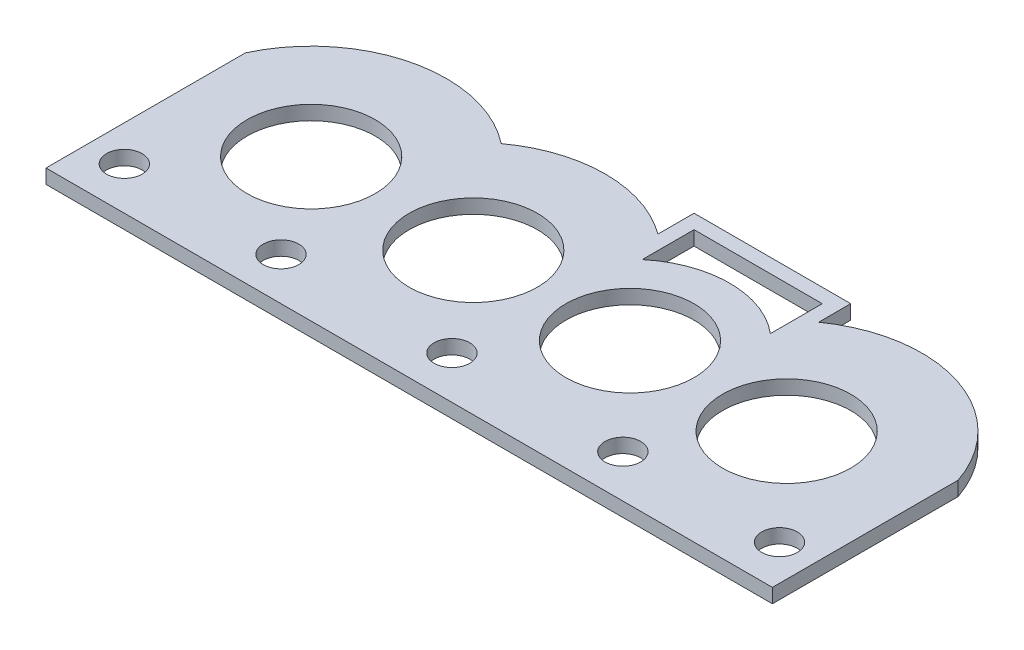
ISO-10303-21;
HEADER;
FILE_DESCRIPTION(('STEP AP214'),'2;1');
FILE_NAME('part.step','',(''),(''),'','','');
FILE_SCHEMA(('AUTOMOTIVE_DESIGN { 1 0 10303 214 1 1 1 1 }'));
ENDSEC;
DATA;
#1=APPLICATION_CONTEXT('core data for automotive mechanical design processes');
#2=APPLICATION_PROTOCOL_DEFINITION('international standard','automotive_design',2000,#1);
#3=PRODUCT_CONTEXT('',#1,'mechanical');
#4=PRODUCT('Part','Part','',(#3));
#5=PRODUCT_RELATED_PRODUCT_CATEGORY('part','',(#4));
#6=PRODUCT_DEFINITION_FORMATION('','',#4);
#7=PRODUCT_DEFINITION_CONTEXT('part definition',#1,'design');
#8=PRODUCT_DEFINITION('design','',#6,#7);
#9=PRODUCT_DEFINITION_SHAPE('','',#8);
#10=(LENGTH_UNIT() NAMED_UNIT(*) SI_UNIT(.MILLI.,.METRE.));
#11=(NAMED_UNIT(*) PLANE_ANGLE_UNIT() SI_UNIT($,.RADIAN.));
#12=(NAMED_UNIT(*) SI_UNIT($,.STERADIAN.) SOLID_ANGLE_UNIT());
#13=UNCERTAINTY_MEASURE_WITH_UNIT(LENGTH_MEASURE(1.E-05),#10,'distance_accuracy_value','');
#14=(GEOMETRIC_REPRESENTATION_CONTEXT(3) GLOBAL_UNCERTAINTY_ASSIGNED_CONTEXT((#13)) GLOBAL_UNIT_ASSIGNED_CONTEXT((#10,
#11,#12)) REPRESENTATION_CONTEXT('',''));
#15=CARTESIAN_POINT('',(0.,0.,0.));
#16=DIRECTION('',(0.,0.,1.));
#17=DIRECTION('',(1.,0.,0.));
#18=AXIS2_PLACEMENT_3D('',#15,#16,#17);
#19=CARTESIAN_POINT('',(35.5,1.,0.));
#20=DIRECTION('',(1.,0.,0.));
#21=DIRECTION('',(0.,0.,-1.));
#22=AXIS2_PLACEMENT_3D('',#19,#20,#21);
#23=PLANE('',#22);
#24=DIRECTION('',(0.,0.,1.));
#25=VECTOR('',#24,1.);
#26=CARTESIAN_POINT('',(35.5,0.,0.));
#27=LINE('',#26,#25);
#28=CARTESIAN_POINT('',(35.5,0.,-19.));
#29=VERTEX_POINT('',#28);
#30=CARTESIAN_POINT('',(35.5,0.,-15.3619026473818));
#31=VERTEX_POINT('',#30);
#32=EDGE_CURVE('E213',#29,#31,#27,.T.);
#33=ORIENTED_EDGE('',*,*,#32,.T.);
#34=DIRECTION('',(0.,-1.,0.));
#35=VECTOR('',#34,1.);
#36=CARTESIAN_POINT('',(35.5,1.,-15.3619026473818));
#37=LINE('',#36,#35);
#38=CARTESIAN_POINT('',(35.5,1.,-15.3619026473818));
#39=VERTEX_POINT('',#38);
#40=EDGE_CURVE('E11',#39,#31,#37,.T.);
#41=ORIENTED_EDGE('',*,*,#40,.F.);
#42=DIRECTION('',(0.,0.,1.));
#43=VECTOR('',#42,1.);
#44=CARTESIAN_POINT('',(35.5,1.,0.));
#45=LINE('',#44,#43);
#46=CARTESIAN_POINT('',(35.5,1.,-19.));
#47=VERTEX_POINT('',#46);
#48=EDGE_CURVE('E148',#47,#39,#45,.T.);
#49=ORIENTED_EDGE('',*,*,#48,.F.);
#50=DIRECTION('',(0.,-1.,0.));
#51=VECTOR('',#50,1.);
#52=CARTESIAN_POINT('',(35.5,1.,-19.));
#53=LINE('',#52,#51);
#54=EDGE_CURVE('E220',#47,#29,#53,.T.);
#55=ORIENTED_EDGE('',*,*,#54,.T.);
#56=EDGE_LOOP('',(#33,#41,#49,#55));
#57=FACE_BOUND('',#56,.T.);
#58=ADVANCED_FACE('F36',(#57),#23,.F.);
#59=CARTESIAN_POINT('',(31.,1.,-10.));
#60=DIRECTION('',(0.,-1.,0.));
#61=DIRECTION('',(0.,0.,-1.));
#62=AXIS2_PLACEMENT_3D('',#59,#60,#61);
#63=CYLINDRICAL_SURFACE('',#62,7.);
#64=CARTESIAN_POINT('',(31.,0.,-10.));
#65=DIRECTION('',(0.,1.,0.));
#66=DIRECTION('',(0.,0.,1.));
#67=AXIS2_PLACEMENT_3D('',#64,#65,#66);
#68=CIRCLE('',#67,7.);
#69=CARTESIAN_POINT('',(26.5,0.,-15.3619026473818));
#70=VERTEX_POINT('',#69);
#71=EDGE_CURVE('E153',#31,#70,#68,.T.);
#72=ORIENTED_EDGE('',*,*,#71,.T.);
#73=DIRECTION('',(0.,-1.,0.));
#74=VECTOR('',#73,1.);
#75=CARTESIAN_POINT('',(26.5,1.,-15.3619026473818));
#76=LINE('',#75,#74);
#77=CARTESIAN_POINT('',(26.5,1.,-15.3619026473818));
#78=VERTEX_POINT('',#77);
#79=EDGE_CURVE('E46',#78,#70,#76,.T.);
#80=ORIENTED_EDGE('',*,*,#79,.F.);
#81=CARTESIAN_POINT('',(31.,1.,-10.));
#82=DIRECTION('',(0.,1.,0.));
#83=DIRECTION('',(0.,0.,1.));
#84=AXIS2_PLACEMENT_3D('',#81,#82,#83);
#85=CIRCLE('',#84,7.);
#86=EDGE_CURVE('E142',#39,#78,#85,.T.);
#87=ORIENTED_EDGE('',*,*,#86,.F.);
#88=ORIENTED_EDGE('',*,*,#40,.T.);
#89=EDGE_LOOP('',(#72,#80,#87,#88));
#90=FACE_BOUND('',#89,.T.);
#91=ADVANCED_FACE('F152',(#90),#63,.T.);
#92=CARTESIAN_POINT('',(26.5,1.,0.));
#93=DIRECTION('',(-1.,0.,0.));
#94=DIRECTION('',(0.,0.,1.));
#95=AXIS2_PLACEMENT_3D('',#92,#93,#94);
#96=PLANE('',#95);
#97=DIRECTION('',(0.,0.,-1.));
#98=VECTOR('',#97,1.);
#99=CARTESIAN_POINT('',(26.5,0.,0.));
#100=LINE('',#99,#98);
#101=CARTESIAN_POINT('',(26.5,0.,-19.));
#102=VERTEX_POINT('',#101);
#103=EDGE_CURVE('E99',#70,#102,#100,.T.);
#104=ORIENTED_EDGE('',*,*,#103,.T.);
#105=DIRECTION('',(0.,-1.,0.));
#106=VECTOR('',#105,1.);
#107=CARTESIAN_POINT('',(26.5,1.,-19.));
#108=LINE('',#107,#106);
#109=CARTESIAN_POINT('',(26.5,1.,-19.));
#110=VERTEX_POINT('',#109);
#111=EDGE_CURVE('E154',#110,#102,#108,.T.);
#112=ORIENTED_EDGE('',*,*,#111,.F.);
#113=DIRECTION('',(0.,0.,-1.));
#114=VECTOR('',#113,1.);
#115=CARTESIAN_POINT('',(26.5,1.,0.));
#116=LINE('',#115,#114);
#117=EDGE_CURVE('E146',#78,#110,#116,.T.);
#118=ORIENTED_EDGE('',*,*,#117,.F.);
#119=ORIENTED_EDGE('',*,*,#79,.T.);
#120=EDGE_LOOP('',(#104,#112,#118,#119));
#121=FACE_BOUND('',#120,.T.);
#122=ADVANCED_FACE('F156',(#121),#96,.F.);
#123=CARTESIAN_POINT('',(20.,1.,-10.));
#124=DIRECTION('',(0.,-1.,0.));
#125=DIRECTION('',(0.,0.,-1.));
#126=AXIS2_PLACEMENT_3D('',#123,#124,#125);
#127=CYLINDRICAL_SURFACE('',#126,9.26976301905927);
#128=CARTESIAN_POINT('',(20.,0.,-10.));
#129=DIRECTION('',(0.,1.,0.));
#130=DIRECTION('',(0.,0.,1.));
#131=AXIS2_PLACEMENT_3D('',#128,#129,#130);
#132=CIRCLE('',#131,9.26976301905927);
#133=CARTESIAN_POINT('',(25.5,0.,-17.4618031620727));
#134=VERTEX_POINT('',#133);
#135=CARTESIAN_POINT('',(14.4982416429588,0.,-17.4605067797198));
#136=VERTEX_POINT('',#135);
#137=EDGE_CURVE('E189',#134,#136,#132,.T.);
#138=ORIENTED_EDGE('',*,*,#137,.T.);
#139=DIRECTION('',(0.,-1.,0.));
#140=VECTOR('',#139,1.);
#141=CARTESIAN_POINT('',(14.4982416429588,1.,-17.4605067797198));
#142=LINE('',#141,#140);
#143=CARTESIAN_POINT('',(14.4982416429588,1.,-17.4605067797198));
#144=VERTEX_POINT('',#143);
#145=EDGE_CURVE('E40',#144,#136,#142,.T.);
#146=ORIENTED_EDGE('',*,*,#145,.F.);
#147=CARTESIAN_POINT('',(20.,1.,-10.));
#148=DIRECTION('',(0.,1.,0.));
#149=DIRECTION('',(0.,0.,1.));
#150=AXIS2_PLACEMENT_3D('',#147,#148,#149);
#151=CIRCLE('',#150,9.26976301905927);
#152=CARTESIAN_POINT('',(25.5,1.,-17.4618031620727));
#153=VERTEX_POINT('',#152);
#154=EDGE_CURVE('E292',#153,#144,#151,.T.);
#155=ORIENTED_EDGE('',*,*,#154,.F.);
#156=DIRECTION('',(0.,-1.,0.));
#157=VECTOR('',#156,1.);
#158=CARTESIAN_POINT('',(25.5,1.,-17.4618031620727));
#159=LINE('',#158,#157);
#160=EDGE_CURVE('E158',#153,#134,#159,.T.);
#161=ORIENTED_EDGE('',*,*,#160,.T.);
#162=EDGE_LOOP('',(#138,#146,#155,#161));
#163=FACE_BOUND('',#162,.T.);
#164=ADVANCED_FACE('F247',(#163),#127,.T.);
#165=CARTESIAN_POINT('',(8.61684396980704,1.,-10.));
#166=DIRECTION('',(0.,-1.,0.));
#167=DIRECTION('',(0.,0.,-1.));
#168=AXIS2_PLACEMENT_3D('',#165,#166,#167);
#169=CYLINDRICAL_SURFACE('',#168,9.5);
#170=CARTESIAN_POINT('',(8.61684396980704,0.,-10.));
#171=DIRECTION('',(0.,1.,0.));
#172=DIRECTION('',(0.,0.,1.));
#173=AXIS2_PLACEMENT_3D('',#170,#171,#172);
#174=CIRCLE('',#173,9.5);
#175=CARTESIAN_POINT('',(0.,0.,-14.));
#176=VERTEX_POINT('',#175);
#177=EDGE_CURVE('E192',#136,#176,#174,.T.);
#178=ORIENTED_EDGE('',*,*,#177,.T.);
#179=DIRECTION('',(0.,-1.,0.));
#180=VECTOR('',#179,1.);
#181=CARTESIAN_POINT('',(0.,1.,-14.));
#182=LINE('',#181,#180);
#183=CARTESIAN_POINT('',(0.,1.,-14.));
#184=VERTEX_POINT('',#183);
#185=EDGE_CURVE('E237',#184,#176,#182,.T.);
#186=ORIENTED_EDGE('',*,*,#185,.F.);
#187=CARTESIAN_POINT('',(8.61684396980704,1.,-10.));
#188=DIRECTION('',(0.,1.,0.));
#189=DIRECTION('',(0.,0.,1.));
#190=AXIS2_PLACEMENT_3D('',#187,#188,#189);
#191=CIRCLE('',#190,9.5);
#192=EDGE_CURVE('E114',#144,#184,#191,.T.);
#193=ORIENTED_EDGE('',*,*,#192,.F.);
#194=ORIENTED_EDGE('',*,*,#145,.T.);
#195=EDGE_LOOP('',(#178,#186,#193,#194));
#196=FACE_BOUND('',#195,.T.);
#197=ADVANCED_FACE('F243',(#196),#169,.T.);
#198=CARTESIAN_POINT('',(0.,1.,0.));
#199=DIRECTION('',(1.,0.,0.));
#200=DIRECTION('',(0.,0.,-1.));
#201=AXIS2_PLACEMENT_3D('',#198,#199,#200);
#202=PLANE('',#201);
#203=DIRECTION('',(0.,0.,1.));
#204=VECTOR('',#203,1.);
#205=CARTESIAN_POINT('',(0.,0.,0.));
#206=LINE('',#205,#204);
#207=CARTESIAN_POINT('',(0.,0.,0.));
#208=VERTEX_POINT('',#207);
#209=EDGE_CURVE('E194',#176,#208,#206,.T.);
#210=ORIENTED_EDGE('',*,*,#209,.T.);
#211=DIRECTION('',(0.,-1.,0.));
#212=VECTOR('',#211,1.);
#213=CARTESIAN_POINT('',(0.,1.,0.));
#214=LINE('',#213,#212);
#215=CARTESIAN_POINT('',(0.,1.,0.));
#216=VERTEX_POINT('',#215);
#217=EDGE_CURVE('E235',#216,#208,#214,.T.);
#218=ORIENTED_EDGE('',*,*,#217,.F.);
#219=DIRECTION('',(0.,0.,1.));
#220=VECTOR('',#219,1.);
#221=CARTESIAN_POINT('',(0.,1.,0.));
#222=LINE('',#221,#220);
#223=EDGE_CURVE('E288',#184,#216,#222,.T.);
#224=ORIENTED_EDGE('',*,*,#223,.F.);
#225=ORIENTED_EDGE('',*,*,#185,.T.);
#226=EDGE_LOOP('',(#210,#218,#224,#225));
#227=FACE_BOUND('',#226,.T.);
#228=ADVANCED_FACE('F287',(#227),#202,.F.);
#229=CARTESIAN_POINT('',(0.,1.,0.));
#230=DIRECTION('',(0.,0.,-1.));
#231=DIRECTION('',(-1.,0.,0.));
#232=AXIS2_PLACEMENT_3D('',#229,#230,#231);
#233=PLANE('',#232);
#234=DIRECTION('',(1.,0.,0.));
#235=VECTOR('',#234,1.);
#236=CARTESIAN_POINT('',(0.,0.,0.));
#237=LINE('',#236,#235);
#238=CARTESIAN_POINT('',(51.,0.,0.));
#239=VERTEX_POINT('',#238);
#240=EDGE_CURVE('E196',#208,#239,#237,.T.);
#241=ORIENTED_EDGE('',*,*,#240,.T.);
#242=DIRECTION('',(0.,-1.,0.));
#243=VECTOR('',#242,1.);
#244=CARTESIAN_POINT('',(51.,1.,0.));
#245=LINE('',#244,#243);
#246=CARTESIAN_POINT('',(51.,1.,0.));
#247=VERTEX_POINT('',#246);
#248=EDGE_CURVE('E233',#247,#239,#245,.T.);
#249=ORIENTED_EDGE('',*,*,#248,.F.);
#250=DIRECTION('',(1.,0.,0.));
#251=VECTOR('',#250,1.);
#252=CARTESIAN_POINT('',(0.,1.,0.));
#253=LINE('',#252,#251);
#254=EDGE_CURVE('E286',#216,#247,#253,.T.);
#255=ORIENTED_EDGE('',*,*,#254,.F.);
#256=ORIENTED_EDGE('',*,*,#217,.T.);
#257=EDGE_LOOP('',(#241,#249,#255,#256));
#258=FACE_BOUND('',#257,.T.);
#259=ADVANCED_FACE('F283',(#258),#233,.F.);
#260=CARTESIAN_POINT('',(51.,1.,0.));
#261=DIRECTION('',(1.,0.,0.));
#262=DIRECTION('',(0.,0.,-1.));
#263=AXIS2_PLACEMENT_3D('',#260,#261,#262);
#264=PLANE('',#263);
#265=DIRECTION('',(0.,0.,1.));
#266=VECTOR('',#265,1.);
#267=CARTESIAN_POINT('',(51.,0.,0.));
#268=LINE('',#267,#266);
#269=CARTESIAN_POINT('',(51.,0.,-13.0413812651491));
#270=VERTEX_POINT('',#269);
#271=EDGE_CURVE('E199',#270,#239,#268,.T.);
#272=ORIENTED_EDGE('',*,*,#271,.F.);
#273=DIRECTION('',(0.,-1.,0.));
#274=VECTOR('',#273,1.);
#275=CARTESIAN_POINT('',(51.,1.,-13.0413812651491));
#276=LINE('',#275,#274);
#277=CARTESIAN_POINT('',(51.,1.,-13.0413812651491));
#278=VERTEX_POINT('',#277);
#279=EDGE_CURVE('E231',#278,#270,#276,.T.);
#280=ORIENTED_EDGE('',*,*,#279,.F.);
#281=DIRECTION('',(0.,0.,1.));
#282=VECTOR('',#281,1.);
#283=CARTESIAN_POINT('',(51.,1.,0.));
#284=LINE('',#283,#282);
#285=EDGE_CURVE('E279',#278,#247,#284,.T.);
#286=ORIENTED_EDGE('',*,*,#285,.T.);
#287=ORIENTED_EDGE('',*,*,#248,.T.);
#288=EDGE_LOOP('',(#272,#280,#286,#287));
#289=FACE_BOUND('',#288,.T.);
#290=ADVANCED_FACE('F278',(#289),#264,.T.);
#291=CARTESIAN_POINT('',(42.,1.,-10.));
#292=DIRECTION('',(0.,-1.,0.));
#293=DIRECTION('',(0.,0.,-1.));
#294=AXIS2_PLACEMENT_3D('',#291,#292,#293);
#295=CYLINDRICAL_SURFACE('',#294,9.5);
#296=CARTESIAN_POINT('',(42.,0.,-10.));
#297=DIRECTION('',(0.,1.,0.));
#298=DIRECTION('',(0.,0.,1.));
#299=AXIS2_PLACEMENT_3D('',#296,#297,#298);
#300=CIRCLE('',#299,9.5);
#301=CARTESIAN_POINT('',(36.5,0.,-17.7459666924148));
#302=VERTEX_POINT('',#301);
#303=EDGE_CURVE('E202',#270,#302,#300,.T.);
#304=ORIENTED_EDGE('',*,*,#303,.T.);
#305=DIRECTION('',(0.,-1.,0.));
#306=VECTOR('',#305,1.);
#307=CARTESIAN_POINT('',(36.5,1.,-17.7459666924148));
#308=LINE('',#307,#306);
#309=CARTESIAN_POINT('',(36.5,1.,-17.7459666924148));
#310=VERTEX_POINT('',#309);
#311=EDGE_CURVE('E228',#310,#302,#308,.T.);
#312=ORIENTED_EDGE('',*,*,#311,.F.);
#313=CARTESIAN_POINT('',(42.,1.,-10.));
#314=DIRECTION('',(0.,1.,0.));
#315=DIRECTION('',(0.,0.,1.));
#316=AXIS2_PLACEMENT_3D('',#313,#314,#315);
#317=CIRCLE('',#316,9.5);
#318=EDGE_CURVE('E274',#278,#310,#317,.T.);
#319=ORIENTED_EDGE('',*,*,#318,.F.);
#320=ORIENTED_EDGE('',*,*,#279,.T.);
#321=EDGE_LOOP('',(#304,#312,#319,#320));
#322=FACE_BOUND('',#321,.T.);
#323=ADVANCED_FACE('F273',(#322),#295,.T.);
#324=CARTESIAN_POINT('',(36.5,1.,0.));
#325=DIRECTION('',(-1.,0.,0.));
#326=DIRECTION('',(0.,0.,1.));
#327=AXIS2_PLACEMENT_3D('',#324,#325,#326);
#328=PLANE('',#327);
#329=DIRECTION('',(0.,0.,-1.));
#330=VECTOR('',#329,1.);
#331=CARTESIAN_POINT('',(36.5,0.,0.));
#332=LINE('',#331,#330);
#333=CARTESIAN_POINT('',(36.5,0.,-20.));
#334=VERTEX_POINT('',#333);
#335=EDGE_CURVE('E204',#302,#334,#332,.T.);
#336=ORIENTED_EDGE('',*,*,#335,.T.);
#337=DIRECTION('',(0.,-1.,0.));
#338=VECTOR('',#337,1.);
#339=CARTESIAN_POINT('',(36.5,1.,-20.));
#340=LINE('',#339,#338);
#341=CARTESIAN_POINT('',(36.5,1.,-20.));
#342=VERTEX_POINT('',#341);
#343=EDGE_CURVE('E226',#342,#334,#340,.T.);
#344=ORIENTED_EDGE('',*,*,#343,.F.);
#345=DIRECTION('',(0.,0.,-1.));
#346=VECTOR('',#345,1.);
#347=CARTESIAN_POINT('',(36.5,1.,0.));
#348=LINE('',#347,#346);
#349=EDGE_CURVE('E270',#310,#342,#348,.T.);
#350=ORIENTED_EDGE('',*,*,#349,.F.);
#351=ORIENTED_EDGE('',*,*,#311,.T.);
#352=EDGE_LOOP('',(#336,#344,#350,#351));
#353=FACE_BOUND('',#352,.T.);
#354=ADVANCED_FACE('F267',(#353),#328,.F.);
#355=CARTESIAN_POINT('',(0.,1.,-20.));
#356=DIRECTION('',(0.,0.,-1.));
#357=DIRECTION('',(-1.,0.,0.));
#358=AXIS2_PLACEMENT_3D('',#355,#356,#357);
#359=PLANE('',#358);
#360=DIRECTION('',(1.,0.,0.));
#361=VECTOR('',#360,1.);
#362=CARTESIAN_POINT('',(0.,0.,-20.));
#363=LINE('',#362,#361);
#364=CARTESIAN_POINT('',(25.5,0.,-20.));
#365=VERTEX_POINT('',#364);
#366=EDGE_CURVE('E207',#365,#334,#363,.T.);
#367=ORIENTED_EDGE('',*,*,#366,.F.);
#368=DIRECTION('',(0.,-1.,0.));
#369=VECTOR('',#368,1.);
#370=CARTESIAN_POINT('',(25.5,1.,-20.));
#371=LINE('',#370,#369);
#372=CARTESIAN_POINT('',(25.5,1.,-20.));
#373=VERTEX_POINT('',#372);
#374=EDGE_CURVE('E224',#373,#365,#371,.T.);
#375=ORIENTED_EDGE('',*,*,#374,.F.);
#376=DIRECTION('',(1.,0.,0.));
#377=VECTOR('',#376,1.);
#378=CARTESIAN_POINT('',(0.,1.,-20.));
#379=LINE('',#378,#377);
#380=EDGE_CURVE('E299',#373,#342,#379,.T.);
#381=ORIENTED_EDGE('',*,*,#380,.T.);
#382=ORIENTED_EDGE('',*,*,#343,.T.);
#383=EDGE_LOOP('',(#367,#375,#381,#382));
#384=FACE_BOUND('',#383,.T.);
#385=ADVANCED_FACE('F261',(#384),#359,.T.);
#386=CARTESIAN_POINT('',(25.5,1.,0.));
#387=DIRECTION('',(-1.,0.,0.));
#388=DIRECTION('',(0.,0.,1.));
#389=AXIS2_PLACEMENT_3D('',#386,#387,#388);
#390=PLANE('',#389);
#391=DIRECTION('',(0.,0.,-1.));
#392=VECTOR('',#391,1.);
#393=CARTESIAN_POINT('',(25.5,0.,0.));
#394=LINE('',#393,#392);
#395=EDGE_CURVE('E210',#134,#365,#394,.T.);
#396=ORIENTED_EDGE('',*,*,#395,.F.);
#397=ORIENTED_EDGE('',*,*,#160,.F.);
#398=DIRECTION('',(0.,0.,-1.));
#399=VECTOR('',#398,1.);
#400=CARTESIAN_POINT('',(25.5,1.,0.));
#401=LINE('',#400,#399);
#402=EDGE_CURVE('E257',#153,#373,#401,.T.);
#403=ORIENTED_EDGE('',*,*,#402,.T.);
#404=ORIENTED_EDGE('',*,*,#374,.T.);
#405=EDGE_LOOP('',(#396,#397,#403,#404));
#406=FACE_BOUND('',#405,.T.);
#407=ADVANCED_FACE('F253',(#406),#390,.T.);
#408=CARTESIAN_POINT('',(13.5,1.,-3.));
#409=DIRECTION('',(0.,-1.,0.));
#410=DIRECTION('',(0.,0.,-1.));
#411=AXIS2_PLACEMENT_3D('',#408,#409,#410);
#412=CYLINDRICAL_SURFACE('',#411,1.25);
#413=CARTESIAN_POINT('',(13.5,1.,-3.));
#414=DIRECTION('',(0.,1.,0.));
#415=DIRECTION('',(0.,0.,1.));
#416=AXIS2_PLACEMENT_3D('',#413,#414,#415);
#417=CIRCLE('',#416,1.25);
#418=CARTESIAN_POINT('',(13.5,1.,-1.75));
#419=VERTEX_POINT('',#418);
#420=EDGE_CURVE('E301',#419,#419,#417,.T.);
#421=ORIENTED_EDGE('',*,*,#420,.T.);
#422=EDGE_LOOP('',(#421));
#423=FACE_BOUND('',#422,.T.);
#424=CARTESIAN_POINT('',(13.5,0.,-3.));
#425=DIRECTION('',(0.,1.,0.));
#426=DIRECTION('',(0.,0.,1.));
#427=AXIS2_PLACEMENT_3D('',#424,#425,#426);
#428=CIRCLE('',#427,1.25);
#429=CARTESIAN_POINT('',(13.5,0.,-1.75));
#430=VERTEX_POINT('',#429);
#431=EDGE_CURVE('E186',#430,#430,#428,.T.);
#432=ORIENTED_EDGE('',*,*,#431,.F.);
#433=EDGE_LOOP('',(#432));
#434=FACE_BOUND('',#433,.T.);
#435=ADVANCED_FACE('F351',(#423,#434),#412,.F.);
#436=CARTESIAN_POINT('',(2.5,1.,-2.99999999999999));
#437=DIRECTION('',(0.,-1.,0.));
#438=DIRECTION('',(0.,0.,-1.));
#439=AXIS2_PLACEMENT_3D('',#436,#437,#438);
#440=CYLINDRICAL_SURFACE('',#439,1.25);
#441=CARTESIAN_POINT('',(2.5,1.,-2.99999999999999));
#442=DIRECTION('',(0.,1.,0.));
#443=DIRECTION('',(0.,0.,1.));
#444=AXIS2_PLACEMENT_3D('',#441,#442,#443);
#445=CIRCLE('',#444,1.25);
#446=CARTESIAN_POINT('',(2.5,1.,-1.74999999999999));
#447=VERTEX_POINT('',#446);
#448=EDGE_CURVE('E303',#447,#447,#445,.T.);
#449=ORIENTED_EDGE('',*,*,#448,.T.);
#450=EDGE_LOOP('',(#449));
#451=FACE_BOUND('',#450,.T.);
#452=CARTESIAN_POINT('',(2.5,0.,-2.99999999999999));
#453=DIRECTION('',(0.,1.,0.));
#454=DIRECTION('',(0.,0.,1.));
#455=AXIS2_PLACEMENT_3D('',#452,#453,#454);
#456=CIRCLE('',#455,1.25);
#457=CARTESIAN_POINT('',(2.5,0.,-1.74999999999999));
#458=VERTEX_POINT('',#457);
#459=EDGE_CURVE('E183',#458,#458,#456,.T.);
#460=ORIENTED_EDGE('',*,*,#459,.F.);
#461=EDGE_LOOP('',(#460));
#462=FACE_BOUND('',#461,.T.);
#463=ADVANCED_FACE('F354',(#451,#462),#440,.F.);
#464=CARTESIAN_POINT('',(42.,1.,-10.));
#465=DIRECTION('',(0.,-1.,0.));
#466=DIRECTION('',(0.,0.,-1.));
#467=AXIS2_PLACEMENT_3D('',#464,#465,#466);
#468=CYLINDRICAL_SURFACE('',#467,4.5);
#469=CARTESIAN_POINT('',(42.,1.,-10.));
#470=DIRECTION('',(0.,1.,0.));
#471=DIRECTION('',(0.,0.,1.));
#472=AXIS2_PLACEMENT_3D('',#469,#470,#471);
#473=CIRCLE('',#472,4.5);
#474=CARTESIAN_POINT('',(42.,1.,-5.5));
#475=VERTEX_POINT('',#474);
#476=EDGE_CURVE('E308',#475,#475,#473,.T.);
#477=ORIENTED_EDGE('',*,*,#476,.T.);
#478=EDGE_LOOP('',(#477));
#479=FACE_BOUND('',#478,.T.);
#480=CARTESIAN_POINT('',(42.,0.,-10.));
#481=DIRECTION('',(0.,1.,0.));
#482=DIRECTION('',(0.,0.,1.));
#483=AXIS2_PLACEMENT_3D('',#480,#481,#482);
#484=CIRCLE('',#483,4.5);
#485=CARTESIAN_POINT('',(42.,0.,-5.5));
#486=VERTEX_POINT('',#485);
#487=EDGE_CURVE('E180',#486,#486,#484,.T.);
#488=ORIENTED_EDGE('',*,*,#487,.F.);
#489=EDGE_LOOP('',(#488));
#490=FACE_BOUND('',#489,.T.);
#491=ADVANCED_FACE('F394',(#479,#490),#468,.F.);
#492=CARTESIAN_POINT('',(31.,1.,-10.));
#493=DIRECTION('',(0.,-1.,0.));
#494=DIRECTION('',(0.,0.,-1.));
#495=AXIS2_PLACEMENT_3D('',#492,#493,#494);
#496=CYLINDRICAL_SURFACE('',#495,4.50000000000002);
#497=CARTESIAN_POINT('',(31.,1.,-10.));
#498=DIRECTION('',(0.,1.,0.));
#499=DIRECTION('',(0.,0.,1.));
#500=AXIS2_PLACEMENT_3D('',#497,#498,#499);
#501=CIRCLE('',#500,4.50000000000002);
#502=CARTESIAN_POINT('',(31.,1.,-5.49999999999998));
#503=VERTEX_POINT('',#502);
#504=EDGE_CURVE('E311',#503,#503,#501,.T.);
#505=ORIENTED_EDGE('',*,*,#504,.T.);
#506=EDGE_LOOP('',(#505));
#507=FACE_BOUND('',#506,.T.);
#508=CARTESIAN_POINT('',(31.,0.,-10.));
#509=DIRECTION('',(0.,1.,0.));
#510=DIRECTION('',(0.,0.,1.));
#511=AXIS2_PLACEMENT_3D('',#508,#509,#510);
#512=CIRCLE('',#511,4.50000000000002);
#513=CARTESIAN_POINT('',(31.,0.,-5.49999999999998));
#514=VERTEX_POINT('',#513);
#515=EDGE_CURVE('E177',#514,#514,#512,.T.);
#516=ORIENTED_EDGE('',*,*,#515,.F.);
#517=EDGE_LOOP('',(#516));
#518=FACE_BOUND('',#517,.T.);
#519=ADVANCED_FACE('F398',(#507,#518),#496,.F.);
#520=CARTESIAN_POINT('',(20.,1.,-10.));
#521=DIRECTION('',(0.,-1.,0.));
#522=DIRECTION('',(0.,0.,-1.));
#523=AXIS2_PLACEMENT_3D('',#520,#521,#522);
#524=CYLINDRICAL_SURFACE('',#523,4.5);
#525=CARTESIAN_POINT('',(20.,1.,-10.));
#526=DIRECTION('',(0.,1.,0.));
#527=DIRECTION('',(0.,0.,1.));
#528=AXIS2_PLACEMENT_3D('',#525,#526,#527);
#529=CIRCLE('',#528,4.5);
#530=CARTESIAN_POINT('',(20.,1.,-5.5));
#531=VERTEX_POINT('',#530);
#532=EDGE_CURVE('E314',#531,#531,#529,.T.);
#533=ORIENTED_EDGE('',*,*,#532,.T.);
#534=EDGE_LOOP('',(#533));
#535=FACE_BOUND('',#534,.T.);
#536=CARTESIAN_POINT('',(20.,0.,-10.));
#537=DIRECTION('',(0.,1.,0.));
#538=DIRECTION('',(0.,0.,1.));
#539=AXIS2_PLACEMENT_3D('',#536,#537,#538);
#540=CIRCLE('',#539,4.5);
#541=CARTESIAN_POINT('',(20.,0.,-5.5));
#542=VERTEX_POINT('',#541);
#543=EDGE_CURVE('E174',#542,#542,#540,.T.);
#544=ORIENTED_EDGE('',*,*,#543,.F.);
#545=EDGE_LOOP('',(#544));
#546=FACE_BOUND('',#545,.T.);
#547=ADVANCED_FACE('F402',(#535,#546),#524,.F.);
#548=CARTESIAN_POINT('',(8.61684396980704,1.,-10.));
#549=DIRECTION('',(0.,-1.,0.));
#550=DIRECTION('',(0.,0.,-1.));
#551=AXIS2_PLACEMENT_3D('',#548,#549,#550);
#552=CYLINDRICAL_SURFACE('',#551,4.5);
#553=CARTESIAN_POINT('',(8.61684396980704,1.,-10.));
#554=DIRECTION('',(0.,1.,0.));
#555=DIRECTION('',(0.,0.,1.));
#556=AXIS2_PLACEMENT_3D('',#553,#554,#555);
#557=CIRCLE('',#556,4.5);
#558=CARTESIAN_POINT('',(8.61684396980704,1.,-5.5));
#559=VERTEX_POINT('',#558);
#560=EDGE_CURVE('E317',#559,#559,#557,.T.);
#561=ORIENTED_EDGE('',*,*,#560,.T.);
#562=EDGE_LOOP('',(#561));
#563=FACE_BOUND('',#562,.T.);
#564=CARTESIAN_POINT('',(8.61684396980704,0.,-10.));
#565=DIRECTION('',(0.,1.,0.));
#566=DIRECTION('',(0.,0.,1.));
#567=AXIS2_PLACEMENT_3D('',#564,#565,#566);
#568=CIRCLE('',#567,4.5);
#569=CARTESIAN_POINT('',(8.61684396980704,0.,-5.5));
#570=VERTEX_POINT('',#569);
#571=EDGE_CURVE('E171',#570,#570,#568,.T.);
#572=ORIENTED_EDGE('',*,*,#571,.F.);
#573=EDGE_LOOP('',(#572));
#574=FACE_BOUND('',#573,.T.);
#575=ADVANCED_FACE('F406',(#563,#574),#552,.F.);
#576=CARTESIAN_POINT('',(25.5,1.,-3.));
#577=DIRECTION('',(0.,-1.,0.));
#578=DIRECTION('',(0.,0.,-1.));
#579=AXIS2_PLACEMENT_3D('',#576,#577,#578);
#580=CYLINDRICAL_SURFACE('',#579,1.25);
#581=CARTESIAN_POINT('',(25.5,1.,-3.));
#582=DIRECTION('',(0.,1.,0.));
#583=DIRECTION('',(0.,0.,1.));
#584=AXIS2_PLACEMENT_3D('',#581,#582,#583);
#585=CIRCLE('',#584,1.25);
#586=CARTESIAN_POINT('',(25.5,1.,-1.75));
#587=VERTEX_POINT('',#586);
#588=EDGE_CURVE('E320',#587,#587,#585,.T.);
#589=ORIENTED_EDGE('',*,*,#588,.T.);
#590=EDGE_LOOP('',(#589));
#591=FACE_BOUND('',#590,.T.);
#592=CARTESIAN_POINT('',(25.5,0.,-3.));
#593=DIRECTION('',(0.,1.,0.));
#594=DIRECTION('',(0.,0.,1.));
#595=AXIS2_PLACEMENT_3D('',#592,#593,#594);
#596=CIRCLE('',#595,1.25);
#597=CARTESIAN_POINT('',(25.5,0.,-1.75));
#598=VERTEX_POINT('',#597);
#599=EDGE_CURVE('E168',#598,#598,#596,.T.);
#600=ORIENTED_EDGE('',*,*,#599,.F.);
#601=EDGE_LOOP('',(#600));
#602=FACE_BOUND('',#601,.T.);
#603=ADVANCED_FACE('F410',(#591,#602),#580,.F.);
#604=CARTESIAN_POINT('',(37.5,1.,-3.));
#605=DIRECTION('',(0.,-1.,0.));
#606=DIRECTION('',(0.,0.,-1.));
#607=AXIS2_PLACEMENT_3D('',#604,#605,#606);
#608=CYLINDRICAL_SURFACE('',#607,1.25);
#609=CARTESIAN_POINT('',(37.5,1.,-3.));
#610=DIRECTION('',(0.,1.,0.));
#611=DIRECTION('',(0.,0.,1.));
#612=AXIS2_PLACEMENT_3D('',#609,#610,#611);
#613=CIRCLE('',#612,1.25);
#614=CARTESIAN_POINT('',(37.5,1.,-1.75));
#615=VERTEX_POINT('',#614);
#616=EDGE_CURVE('E323',#615,#615,#613,.T.);
#617=ORIENTED_EDGE('',*,*,#616,.T.);
#618=EDGE_LOOP('',(#617));
#619=FACE_BOUND('',#618,.T.);
#620=CARTESIAN_POINT('',(37.5,0.,-3.));
#621=DIRECTION('',(0.,1.,0.));
#622=DIRECTION('',(0.,0.,1.));
#623=AXIS2_PLACEMENT_3D('',#620,#621,#622);
#624=CIRCLE('',#623,1.25);
#625=CARTESIAN_POINT('',(37.5,0.,-1.75));
#626=VERTEX_POINT('',#625);
#627=EDGE_CURVE('E165',#626,#626,#624,.T.);
#628=ORIENTED_EDGE('',*,*,#627,.F.);
#629=EDGE_LOOP('',(#628));
#630=FACE_BOUND('',#629,.T.);
#631=ADVANCED_FACE('F413',(#619,#630),#608,.F.);
#632=CARTESIAN_POINT('',(48.5,1.,-3.));
#633=DIRECTION('',(0.,-1.,0.));
#634=DIRECTION('',(0.,0.,-1.));
#635=AXIS2_PLACEMENT_3D('',#632,#633,#634);
#636=CYLINDRICAL_SURFACE('',#635,1.25);
#637=CARTESIAN_POINT('',(48.5,1.,-3.));
#638=DIRECTION('',(0.,1.,0.));
#639=DIRECTION('',(0.,0.,1.));
#640=AXIS2_PLACEMENT_3D('',#637,#638,#639);
#641=CIRCLE('',#640,1.25);
#642=CARTESIAN_POINT('',(48.5,1.,-1.75));
#643=VERTEX_POINT('',#642);
#644=EDGE_CURVE('E219',#643,#643,#641,.T.);
#645=ORIENTED_EDGE('',*,*,#644,.T.);
#646=EDGE_LOOP('',(#645));
#647=FACE_BOUND('',#646,.T.);
#648=CARTESIAN_POINT('',(48.5,0.,-3.));
#649=DIRECTION('',(0.,1.,0.));
#650=DIRECTION('',(0.,0.,1.));
#651=AXIS2_PLACEMENT_3D('',#648,#649,#650);
#652=CIRCLE('',#651,1.25);
#653=CARTESIAN_POINT('',(48.5,0.,-1.75));
#654=VERTEX_POINT('',#653);
#655=EDGE_CURVE('E162',#654,#654,#652,.T.);
#656=ORIENTED_EDGE('',*,*,#655,.F.);
#657=EDGE_LOOP('',(#656));
#658=FACE_BOUND('',#657,.T.);
#659=ADVANCED_FACE('F38',(#647,#658),#636,.F.);
#660=CARTESIAN_POINT('',(0.,1.,-19.));
#661=DIRECTION('',(0.,0.,-1.));
#662=DIRECTION('',(-1.,0.,0.));
#663=AXIS2_PLACEMENT_3D('',#660,#661,#662);
#664=PLANE('',#663);
#665=DIRECTION('',(1.,0.,0.));
#666=VECTOR('',#665,1.);
#667=CARTESIAN_POINT('',(0.,0.,-19.));
#668=LINE('',#667,#666);
#669=EDGE_CURVE('E105',#102,#29,#668,.T.);
#670=ORIENTED_EDGE('',*,*,#669,.T.);
#671=ORIENTED_EDGE('',*,*,#54,.F.);
#672=DIRECTION('',(1.,0.,0.));
#673=VECTOR('',#672,1.);
#674=CARTESIAN_POINT('',(0.,1.,-19.));
#675=LINE('',#674,#673);
#676=EDGE_CURVE('E55',#110,#47,#675,.T.);
#677=ORIENTED_EDGE('',*,*,#676,.F.);
#678=ORIENTED_EDGE('',*,*,#111,.T.);
#679=EDGE_LOOP('',(#670,#671,#677,#678));
#680=FACE_BOUND('',#679,.T.);
#681=ADVANCED_FACE('F333',(#680),#664,.F.);
#682=CARTESIAN_POINT('',(0.,1.,0.));
#683=DIRECTION('',(0.,1.,0.));
#684=DIRECTION('',(0.,0.,1.));
#685=AXIS2_PLACEMENT_3D('',#682,#683,#684);
#686=PLANE('',#685);
#687=ORIENTED_EDGE('',*,*,#644,.F.);
#688=EDGE_LOOP('',(#687));
#689=FACE_BOUND('',#688,.T.);
#690=ORIENTED_EDGE('',*,*,#616,.F.);
#691=EDGE_LOOP('',(#690));
#692=FACE_BOUND('',#691,.T.);
#693=ORIENTED_EDGE('',*,*,#588,.F.);
#694=EDGE_LOOP('',(#693));
#695=FACE_BOUND('',#694,.T.);
#696=ORIENTED_EDGE('',*,*,#560,.F.);
#697=EDGE_LOOP('',(#696));
#698=FACE_BOUND('',#697,.T.);
#699=ORIENTED_EDGE('',*,*,#532,.F.);
#700=EDGE_LOOP('',(#699));
#701=FACE_BOUND('',#700,.T.);
#702=ORIENTED_EDGE('',*,*,#504,.F.);
#703=EDGE_LOOP('',(#702));
#704=FACE_BOUND('',#703,.T.);
#705=ORIENTED_EDGE('',*,*,#476,.F.);
#706=EDGE_LOOP('',(#705));
#707=FACE_BOUND('',#706,.T.);
#708=ORIENTED_EDGE('',*,*,#448,.F.);
#709=EDGE_LOOP('',(#708));
#710=FACE_BOUND('',#709,.T.);
#711=ORIENTED_EDGE('',*,*,#420,.F.);
#712=EDGE_LOOP('',(#711));
#713=FACE_BOUND('',#712,.T.);
#714=ORIENTED_EDGE('',*,*,#154,.T.);
#715=ORIENTED_EDGE('',*,*,#192,.T.);
#716=ORIENTED_EDGE('',*,*,#223,.T.);
#717=ORIENTED_EDGE('',*,*,#254,.T.);
#718=ORIENTED_EDGE('',*,*,#285,.F.);
#719=ORIENTED_EDGE('',*,*,#318,.T.);
#720=ORIENTED_EDGE('',*,*,#349,.T.);
#721=ORIENTED_EDGE('',*,*,#380,.F.);
#722=ORIENTED_EDGE('',*,*,#402,.F.);
#723=EDGE_LOOP('',(#714,#715,#716,#717,#718,#719,#720,#721,#722));
#724=FACE_BOUND('',#723,.T.);
#725=ORIENTED_EDGE('',*,*,#48,.T.);
#726=ORIENTED_EDGE('',*,*,#86,.T.);
#727=ORIENTED_EDGE('',*,*,#117,.T.);
#728=ORIENTED_EDGE('',*,*,#676,.T.);
#729=EDGE_LOOP('',(#725,#726,#727,#728));
#730=FACE_BOUND('',#729,.T.);
#731=ADVANCED_FACE('F144',(#689,#692,#695,#698,#701,#704,#707,#710,#713,#724,#730),#686,.T.);
#732=CARTESIAN_POINT('',(0.,0.,0.));
#733=DIRECTION('',(0.,1.,0.));
#734=DIRECTION('',(0.,0.,1.));
#735=AXIS2_PLACEMENT_3D('',#732,#733,#734);
#736=PLANE('',#735);
#737=ORIENTED_EDGE('',*,*,#655,.T.);
#738=EDGE_LOOP('',(#737));
#739=FACE_BOUND('',#738,.T.);
#740=ORIENTED_EDGE('',*,*,#627,.T.);
#741=EDGE_LOOP('',(#740));
#742=FACE_BOUND('',#741,.T.);
#743=ORIENTED_EDGE('',*,*,#599,.T.);
#744=EDGE_LOOP('',(#743));
#745=FACE_BOUND('',#744,.T.);
#746=ORIENTED_EDGE('',*,*,#571,.T.);
#747=EDGE_LOOP('',(#746));
#748=FACE_BOUND('',#747,.T.);
#749=ORIENTED_EDGE('',*,*,#543,.T.);
#750=EDGE_LOOP('',(#749));
#751=FACE_BOUND('',#750,.T.);
#752=ORIENTED_EDGE('',*,*,#515,.T.);
#753=EDGE_LOOP('',(#752));
#754=FACE_BOUND('',#753,.T.);
#755=ORIENTED_EDGE('',*,*,#487,.T.);
#756=EDGE_LOOP('',(#755));
#757=FACE_BOUND('',#756,.T.);
#758=ORIENTED_EDGE('',*,*,#459,.T.);
#759=EDGE_LOOP('',(#758));
#760=FACE_BOUND('',#759,.T.);
#761=ORIENTED_EDGE('',*,*,#431,.T.);
#762=EDGE_LOOP('',(#761));
#763=FACE_BOUND('',#762,.T.);
#764=ORIENTED_EDGE('',*,*,#137,.F.);
#765=ORIENTED_EDGE('',*,*,#395,.T.);
#766=ORIENTED_EDGE('',*,*,#366,.T.);
#767=ORIENTED_EDGE('',*,*,#335,.F.);
#768=ORIENTED_EDGE('',*,*,#303,.F.);
#769=ORIENTED_EDGE('',*,*,#271,.T.);
#770=ORIENTED_EDGE('',*,*,#240,.F.);
#771=ORIENTED_EDGE('',*,*,#209,.F.);
#772=ORIENTED_EDGE('',*,*,#177,.F.);
#773=EDGE_LOOP('',(#764,#765,#766,#767,#768,#769,#770,#771,#772));
#774=FACE_BOUND('',#773,.T.);
#775=ORIENTED_EDGE('',*,*,#32,.F.);
#776=ORIENTED_EDGE('',*,*,#669,.F.);
#777=ORIENTED_EDGE('',*,*,#103,.F.);
#778=ORIENTED_EDGE('',*,*,#71,.F.);
#779=EDGE_LOOP('',(#775,#776,#777,#778));
#780=FACE_BOUND('',#779,.T.);
#781=ADVANCED_FACE('F250',(#739,#742,#745,#748,#751,#754,#757,#760,#763,#774,#780),#736,.F.);
#782=CLOSED_SHELL('',(#58,#91,#122,#164,#197,#228,#259,#290,#323,#354,#385,#407,#435,#463,#491,
#519,#547,#575,#603,#631,#659,#681,#731,#781));
#783=MANIFOLD_SOLID_BREP('B2',#782);
#784=ADVANCED_BREP_SHAPE_REPRESENTATION('',(#18,#783),#14);
#785=SHAPE_DEFINITION_REPRESENTATION(#9,#784);
ENDSEC;
END-ISO-10303-21;
